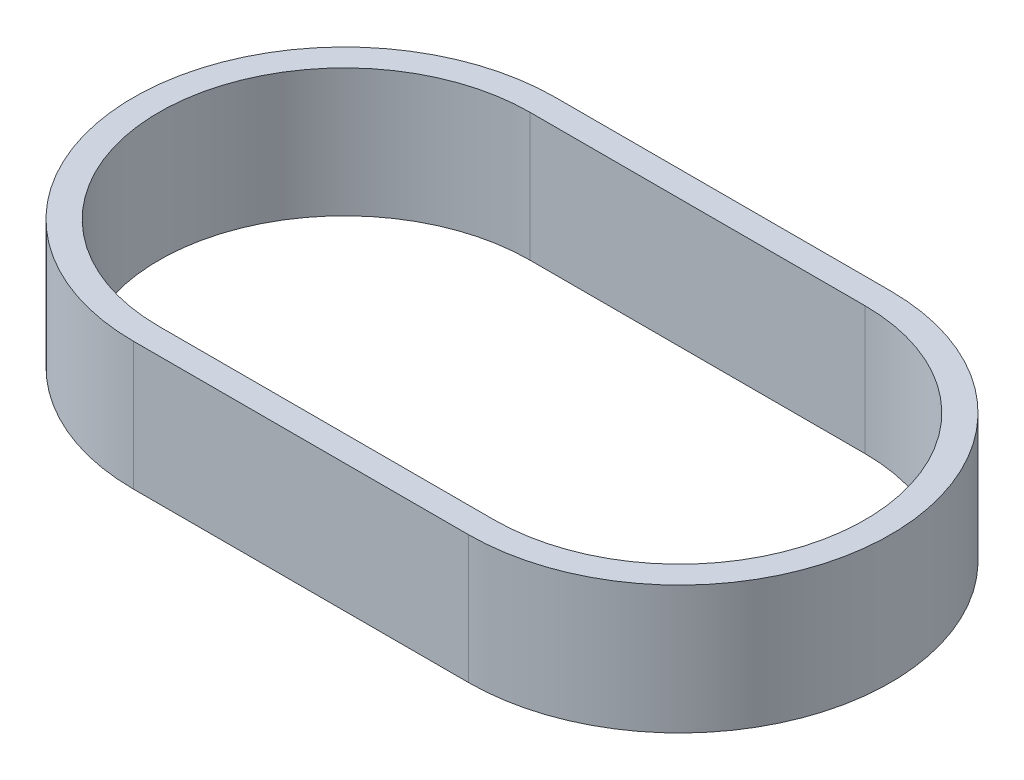
ISO-10303-21;
HEADER;
FILE_DESCRIPTION(('STEP AP214'),'2;1');
FILE_NAME('part.step','',(''),(''),'','','');
FILE_SCHEMA(('AUTOMOTIVE_DESIGN { 1 0 10303 214 1 1 1 1 }'));
ENDSEC;
DATA;
#1=APPLICATION_CONTEXT('core data for automotive mechanical design processes');
#2=APPLICATION_PROTOCOL_DEFINITION('international standard','automotive_design',2000,#1);
#3=PRODUCT_CONTEXT('',#1,'mechanical');
#4=PRODUCT('Part','Part','',(#3));
#5=PRODUCT_RELATED_PRODUCT_CATEGORY('part','',(#4));
#6=PRODUCT_DEFINITION_FORMATION('','',#4);
#7=PRODUCT_DEFINITION_CONTEXT('part definition',#1,'design');
#8=PRODUCT_DEFINITION('design','',#6,#7);
#9=PRODUCT_DEFINITION_SHAPE('','',#8);
#10=(LENGTH_UNIT() NAMED_UNIT(*) SI_UNIT(.MILLI.,.METRE.));
#11=(NAMED_UNIT(*) PLANE_ANGLE_UNIT() SI_UNIT($,.RADIAN.));
#12=(NAMED_UNIT(*) SI_UNIT($,.STERADIAN.) SOLID_ANGLE_UNIT());
#13=UNCERTAINTY_MEASURE_WITH_UNIT(LENGTH_MEASURE(1.E-05),#10,'distance_accuracy_value','');
#14=(GEOMETRIC_REPRESENTATION_CONTEXT(3) GLOBAL_UNCERTAINTY_ASSIGNED_CONTEXT((#13)) GLOBAL_UNIT_ASSIGNED_CONTEXT((#10,
#11,#12)) REPRESENTATION_CONTEXT('',''));
#15=CARTESIAN_POINT('',(0.,0.,0.));
#16=DIRECTION('',(0.,0.,1.));
#17=DIRECTION('',(1.,0.,0.));
#18=AXIS2_PLACEMENT_3D('',#15,#16,#17);
#19=CARTESIAN_POINT('',(13.081,10.,0.));
#20=DIRECTION('',(0.,1.,0.));
#21=DIRECTION('',(0.,0.,1.));
#22=AXIS2_PLACEMENT_3D('',#19,#20,#21);
#23=PLANE('',#22);
#24=DIRECTION('',(1.,0.,0.));
#25=VECTOR('',#24,1.);
#26=CARTESIAN_POINT('',(-13.081,10.,-16.478));
#27=LINE('',#26,#25);
#28=CARTESIAN_POINT('',(-13.081,10.,-16.478));
#29=VERTEX_POINT('',#28);
#30=CARTESIAN_POINT('',(13.081,10.,-16.478));
#31=VERTEX_POINT('',#30);
#32=EDGE_CURVE('E158',#29,#31,#27,.T.);
#33=ORIENTED_EDGE('',*,*,#32,.F.);
#34=CARTESIAN_POINT('',(-13.081,10.,0.));
#35=DIRECTION('',(0.,1.,0.));
#36=DIRECTION('',(0.,0.,1.));
#37=AXIS2_PLACEMENT_3D('',#34,#35,#36);
#38=CIRCLE('',#37,16.478);
#39=CARTESIAN_POINT('',(-13.081,10.,16.478));
#40=VERTEX_POINT('',#39);
#41=EDGE_CURVE('E166',#29,#40,#38,.T.);
#42=ORIENTED_EDGE('',*,*,#41,.T.);
#43=DIRECTION('',(1.,0.,0.));
#44=VECTOR('',#43,1.);
#45=CARTESIAN_POINT('',(-13.081,10.,16.478));
#46=LINE('',#45,#44);
#47=CARTESIAN_POINT('',(13.081,10.,16.478));
#48=VERTEX_POINT('',#47);
#49=EDGE_CURVE('E164',#40,#48,#46,.T.);
#50=ORIENTED_EDGE('',*,*,#49,.T.);
#51=CARTESIAN_POINT('',(13.081,10.,0.));
#52=DIRECTION('',(0.,1.,0.));
#53=DIRECTION('',(0.,0.,1.));
#54=AXIS2_PLACEMENT_3D('',#51,#52,#53);
#55=CIRCLE('',#54,16.478);
#56=EDGE_CURVE('E161',#48,#31,#55,.T.);
#57=ORIENTED_EDGE('',*,*,#56,.T.);
#58=EDGE_LOOP('',(#33,#42,#50,#57));
#59=FACE_BOUND('',#58,.T.);
#60=DIRECTION('',(1.,0.,0.));
#61=VECTOR('',#60,1.);
#62=CARTESIAN_POINT('',(-13.081,10.,14.478));
#63=LINE('',#62,#61);
#64=CARTESIAN_POINT('',(-13.081,10.,14.478));
#65=VERTEX_POINT('',#64);
#66=CARTESIAN_POINT('',(13.081,10.,14.478));
#67=VERTEX_POINT('',#66);
#68=EDGE_CURVE('E131',#65,#67,#63,.T.);
#69=ORIENTED_EDGE('',*,*,#68,.F.);
#70=CARTESIAN_POINT('',(-13.081,10.,0.));
#71=DIRECTION('',(0.,1.,0.));
#72=DIRECTION('',(0.,0.,1.));
#73=AXIS2_PLACEMENT_3D('',#70,#71,#72);
#74=CIRCLE('',#73,14.478);
#75=CARTESIAN_POINT('',(-13.081,10.,-14.478));
#76=VERTEX_POINT('',#75);
#77=EDGE_CURVE('E123',#76,#65,#74,.T.);
#78=ORIENTED_EDGE('',*,*,#77,.F.);
#79=DIRECTION('',(1.,0.,0.));
#80=VECTOR('',#79,1.);
#81=CARTESIAN_POINT('',(-13.081,10.,-14.478));
#82=LINE('',#81,#80);
#83=CARTESIAN_POINT('',(13.081,10.,-14.478));
#84=VERTEX_POINT('',#83);
#85=EDGE_CURVE('E145',#76,#84,#82,.T.);
#86=ORIENTED_EDGE('',*,*,#85,.T.);
#87=CARTESIAN_POINT('',(13.081,10.,0.));
#88=DIRECTION('',(0.,1.,0.));
#89=DIRECTION('',(0.,0.,1.));
#90=AXIS2_PLACEMENT_3D('',#87,#88,#89);
#91=CIRCLE('',#90,14.478);
#92=EDGE_CURVE('E143',#67,#84,#91,.T.);
#93=ORIENTED_EDGE('',*,*,#92,.F.);
#94=EDGE_LOOP('',(#69,#78,#86,#93));
#95=FACE_BOUND('',#94,.T.);
#96=ADVANCED_FACE('F57',(#59,#95),#23,.T.);
#97=CARTESIAN_POINT('',(13.081,0.,0.));
#98=DIRECTION('',(0.,1.,0.));
#99=DIRECTION('',(0.,0.,1.));
#100=AXIS2_PLACEMENT_3D('',#97,#98,#99);
#101=PLANE('',#100);
#102=DIRECTION('',(1.,0.,0.));
#103=VECTOR('',#102,1.);
#104=CARTESIAN_POINT('',(-13.081,0.,-16.478));
#105=LINE('',#104,#103);
#106=CARTESIAN_POINT('',(-13.081,0.,-16.478));
#107=VERTEX_POINT('',#106);
#108=CARTESIAN_POINT('',(13.081,0.,-16.478));
#109=VERTEX_POINT('',#108);
#110=EDGE_CURVE('E139',#107,#109,#105,.T.);
#111=ORIENTED_EDGE('',*,*,#110,.T.);
#112=CARTESIAN_POINT('',(13.081,0.,0.));
#113=DIRECTION('',(0.,1.,0.));
#114=DIRECTION('',(0.,0.,1.));
#115=AXIS2_PLACEMENT_3D('',#112,#113,#114);
#116=CIRCLE('',#115,16.478);
#117=CARTESIAN_POINT('',(13.081,0.,16.478));
#118=VERTEX_POINT('',#117);
#119=EDGE_CURVE('E170',#118,#109,#116,.T.);
#120=ORIENTED_EDGE('',*,*,#119,.F.);
#121=DIRECTION('',(1.,0.,0.));
#122=VECTOR('',#121,1.);
#123=CARTESIAN_POINT('',(-13.081,0.,16.478));
#124=LINE('',#123,#122);
#125=CARTESIAN_POINT('',(-13.081,0.,16.478));
#126=VERTEX_POINT('',#125);
#127=EDGE_CURVE('E173',#126,#118,#124,.T.);
#128=ORIENTED_EDGE('',*,*,#127,.F.);
#129=CARTESIAN_POINT('',(-13.081,0.,0.));
#130=DIRECTION('',(0.,1.,0.));
#131=DIRECTION('',(0.,0.,1.));
#132=AXIS2_PLACEMENT_3D('',#129,#130,#131);
#133=CIRCLE('',#132,16.478);
#134=EDGE_CURVE('E162',#107,#126,#133,.T.);
#135=ORIENTED_EDGE('',*,*,#134,.F.);
#136=EDGE_LOOP('',(#111,#120,#128,#135));
#137=FACE_BOUND('',#136,.T.);
#138=CARTESIAN_POINT('',(-13.081,0.,0.));
#139=DIRECTION('',(0.,1.,0.));
#140=DIRECTION('',(0.,0.,1.));
#141=AXIS2_PLACEMENT_3D('',#138,#139,#140);
#142=CIRCLE('',#141,14.478);
#143=CARTESIAN_POINT('',(-13.081,0.,-14.478));
#144=VERTEX_POINT('',#143);
#145=CARTESIAN_POINT('',(-13.081,0.,14.478));
#146=VERTEX_POINT('',#145);
#147=EDGE_CURVE('E82',#144,#146,#142,.T.);
#148=ORIENTED_EDGE('',*,*,#147,.T.);
#149=DIRECTION('',(1.,0.,0.));
#150=VECTOR('',#149,1.);
#151=CARTESIAN_POINT('',(-13.081,0.,14.478));
#152=LINE('',#151,#150);
#153=CARTESIAN_POINT('',(13.081,0.,14.478));
#154=VERTEX_POINT('',#153);
#155=EDGE_CURVE('E138',#146,#154,#152,.T.);
#156=ORIENTED_EDGE('',*,*,#155,.T.);
#157=CARTESIAN_POINT('',(13.081,0.,0.));
#158=DIRECTION('',(0.,1.,0.));
#159=DIRECTION('',(0.,0.,1.));
#160=AXIS2_PLACEMENT_3D('',#157,#158,#159);
#161=CIRCLE('',#160,14.478);
#162=CARTESIAN_POINT('',(13.081,0.,-14.478));
#163=VERTEX_POINT('',#162);
#164=EDGE_CURVE('E151',#154,#163,#161,.T.);
#165=ORIENTED_EDGE('',*,*,#164,.T.);
#166=DIRECTION('',(1.,0.,0.));
#167=VECTOR('',#166,1.);
#168=CARTESIAN_POINT('',(-13.081,0.,-14.478));
#169=LINE('',#168,#167);
#170=EDGE_CURVE('E132',#144,#163,#169,.T.);
#171=ORIENTED_EDGE('',*,*,#170,.F.);
#172=EDGE_LOOP('',(#148,#156,#165,#171));
#173=FACE_BOUND('',#172,.T.);
#174=ADVANCED_FACE('F191',(#137,#173),#101,.F.);
#175=CARTESIAN_POINT('',(-13.081,10.,-16.478));
#176=DIRECTION('',(0.,0.,-1.));
#177=DIRECTION('',(-1.,0.,0.));
#178=AXIS2_PLACEMENT_3D('',#175,#176,#177);
#179=PLANE('',#178);
#180=ORIENTED_EDGE('',*,*,#110,.F.);
#181=DIRECTION('',(0.,-1.,0.));
#182=VECTOR('',#181,1.);
#183=CARTESIAN_POINT('',(-13.081,10.,-16.478));
#184=LINE('',#183,#182);
#185=EDGE_CURVE('E12',#29,#107,#184,.T.);
#186=ORIENTED_EDGE('',*,*,#185,.F.);
#187=ORIENTED_EDGE('',*,*,#32,.T.);
#188=DIRECTION('',(0.,-1.,0.));
#189=VECTOR('',#188,1.);
#190=CARTESIAN_POINT('',(13.081,10.,-16.478));
#191=LINE('',#190,#189);
#192=EDGE_CURVE('E61',#31,#109,#191,.T.);
#193=ORIENTED_EDGE('',*,*,#192,.T.);
#194=EDGE_LOOP('',(#180,#186,#187,#193));
#195=FACE_BOUND('',#194,.T.);
#196=ADVANCED_FACE('F59',(#195),#179,.T.);
#197=CARTESIAN_POINT('',(-13.081,10.,0.));
#198=DIRECTION('',(0.,-1.,0.));
#199=DIRECTION('',(0.,0.,-1.));
#200=AXIS2_PLACEMENT_3D('',#197,#198,#199);
#201=CYLINDRICAL_SURFACE('',#200,16.478);
#202=ORIENTED_EDGE('',*,*,#134,.T.);
#203=DIRECTION('',(0.,-1.,0.));
#204=VECTOR('',#203,1.);
#205=CARTESIAN_POINT('',(-13.081,10.,16.478));
#206=LINE('',#205,#204);
#207=EDGE_CURVE('E66',#40,#126,#206,.T.);
#208=ORIENTED_EDGE('',*,*,#207,.F.);
#209=ORIENTED_EDGE('',*,*,#41,.F.);
#210=ORIENTED_EDGE('',*,*,#185,.T.);
#211=EDGE_LOOP('',(#202,#208,#209,#210));
#212=FACE_BOUND('',#211,.T.);
#213=ADVANCED_FACE('F195',(#212),#201,.T.);
#214=CARTESIAN_POINT('',(-13.081,10.,16.478));
#215=DIRECTION('',(0.,0.,-1.));
#216=DIRECTION('',(-1.,0.,0.));
#217=AXIS2_PLACEMENT_3D('',#214,#215,#216);
#218=PLANE('',#217);
#219=ORIENTED_EDGE('',*,*,#127,.T.);
#220=DIRECTION('',(0.,-1.,0.));
#221=VECTOR('',#220,1.);
#222=CARTESIAN_POINT('',(13.081,10.,16.478));
#223=LINE('',#222,#221);
#224=EDGE_CURVE('E177',#48,#118,#223,.T.);
#225=ORIENTED_EDGE('',*,*,#224,.F.);
#226=ORIENTED_EDGE('',*,*,#49,.F.);
#227=ORIENTED_EDGE('',*,*,#207,.T.);
#228=EDGE_LOOP('',(#219,#225,#226,#227));
#229=FACE_BOUND('',#228,.T.);
#230=ADVANCED_FACE('F199',(#229),#218,.F.);
#231=CARTESIAN_POINT('',(13.081,10.,0.));
#232=DIRECTION('',(0.,-1.,0.));
#233=DIRECTION('',(0.,0.,-1.));
#234=AXIS2_PLACEMENT_3D('',#231,#232,#233);
#235=CYLINDRICAL_SURFACE('',#234,16.478);
#236=ORIENTED_EDGE('',*,*,#119,.T.);
#237=ORIENTED_EDGE('',*,*,#192,.F.);
#238=ORIENTED_EDGE('',*,*,#56,.F.);
#239=ORIENTED_EDGE('',*,*,#224,.T.);
#240=EDGE_LOOP('',(#236,#237,#238,#239));
#241=FACE_BOUND('',#240,.T.);
#242=ADVANCED_FACE('F187',(#241),#235,.T.);
#243=CARTESIAN_POINT('',(-13.081,10.,0.));
#244=DIRECTION('',(0.,-1.,0.));
#245=DIRECTION('',(0.,0.,-1.));
#246=AXIS2_PLACEMENT_3D('',#243,#244,#245);
#247=CYLINDRICAL_SURFACE('',#246,14.478);
#248=ORIENTED_EDGE('',*,*,#147,.F.);
#249=DIRECTION('',(0.,-1.,0.));
#250=VECTOR('',#249,1.);
#251=CARTESIAN_POINT('',(-13.081,10.,-14.478));
#252=LINE('',#251,#250);
#253=EDGE_CURVE('E127',#76,#144,#252,.T.);
#254=ORIENTED_EDGE('',*,*,#253,.F.);
#255=ORIENTED_EDGE('',*,*,#77,.T.);
#256=DIRECTION('',(0.,-1.,0.));
#257=VECTOR('',#256,1.);
#258=CARTESIAN_POINT('',(-13.081,10.,14.478));
#259=LINE('',#258,#257);
#260=EDGE_CURVE('E126',#65,#146,#259,.T.);
#261=ORIENTED_EDGE('',*,*,#260,.T.);
#262=EDGE_LOOP('',(#248,#254,#255,#261));
#263=FACE_BOUND('',#262,.T.);
#264=ADVANCED_FACE('F125',(#263),#247,.F.);
#265=CARTESIAN_POINT('',(-13.081,10.,14.478));
#266=DIRECTION('',(0.,0.,-1.));
#267=DIRECTION('',(-1.,0.,0.));
#268=AXIS2_PLACEMENT_3D('',#265,#266,#267);
#269=PLANE('',#268);
#270=ORIENTED_EDGE('',*,*,#155,.F.);
#271=ORIENTED_EDGE('',*,*,#260,.F.);
#272=ORIENTED_EDGE('',*,*,#68,.T.);
#273=DIRECTION('',(0.,-1.,0.));
#274=VECTOR('',#273,1.);
#275=CARTESIAN_POINT('',(13.081,10.,14.478));
#276=LINE('',#275,#274);
#277=EDGE_CURVE('E140',#67,#154,#276,.T.);
#278=ORIENTED_EDGE('',*,*,#277,.T.);
#279=EDGE_LOOP('',(#270,#271,#272,#278));
#280=FACE_BOUND('',#279,.T.);
#281=ADVANCED_FACE('F135',(#280),#269,.T.);
#282=CARTESIAN_POINT('',(13.081,10.,0.));
#283=DIRECTION('',(0.,-1.,0.));
#284=DIRECTION('',(0.,0.,-1.));
#285=AXIS2_PLACEMENT_3D('',#282,#283,#284);
#286=CYLINDRICAL_SURFACE('',#285,14.478);
#287=ORIENTED_EDGE('',*,*,#164,.F.);
#288=ORIENTED_EDGE('',*,*,#277,.F.);
#289=ORIENTED_EDGE('',*,*,#92,.T.);
#290=DIRECTION('',(0.,-1.,0.));
#291=VECTOR('',#290,1.);
#292=CARTESIAN_POINT('',(13.081,10.,-14.478));
#293=LINE('',#292,#291);
#294=EDGE_CURVE('E74',#84,#163,#293,.T.);
#295=ORIENTED_EDGE('',*,*,#294,.T.);
#296=EDGE_LOOP('',(#287,#288,#289,#295));
#297=FACE_BOUND('',#296,.T.);
#298=ADVANCED_FACE('F220',(#297),#286,.F.);
#299=CARTESIAN_POINT('',(-13.081,10.,-14.478));
#300=DIRECTION('',(0.,0.,-1.));
#301=DIRECTION('',(-1.,0.,0.));
#302=AXIS2_PLACEMENT_3D('',#299,#300,#301);
#303=PLANE('',#302);
#304=ORIENTED_EDGE('',*,*,#170,.T.);
#305=ORIENTED_EDGE('',*,*,#294,.F.);
#306=ORIENTED_EDGE('',*,*,#85,.F.);
#307=ORIENTED_EDGE('',*,*,#253,.T.);
#308=EDGE_LOOP('',(#304,#305,#306,#307));
#309=FACE_BOUND('',#308,.T.);
#310=ADVANCED_FACE('F224',(#309),#303,.F.);
#311=CLOSED_SHELL('',(#96,#174,#196,#213,#230,#242,#264,#281,#298,#310));
#312=MANIFOLD_SOLID_BREP('B2',#311);
#313=ADVANCED_BREP_SHAPE_REPRESENTATION('',(#18,#312),#14);
#314=SHAPE_DEFINITION_REPRESENTATION(#9,#313);
ENDSEC;
END-ISO-10303-21;
